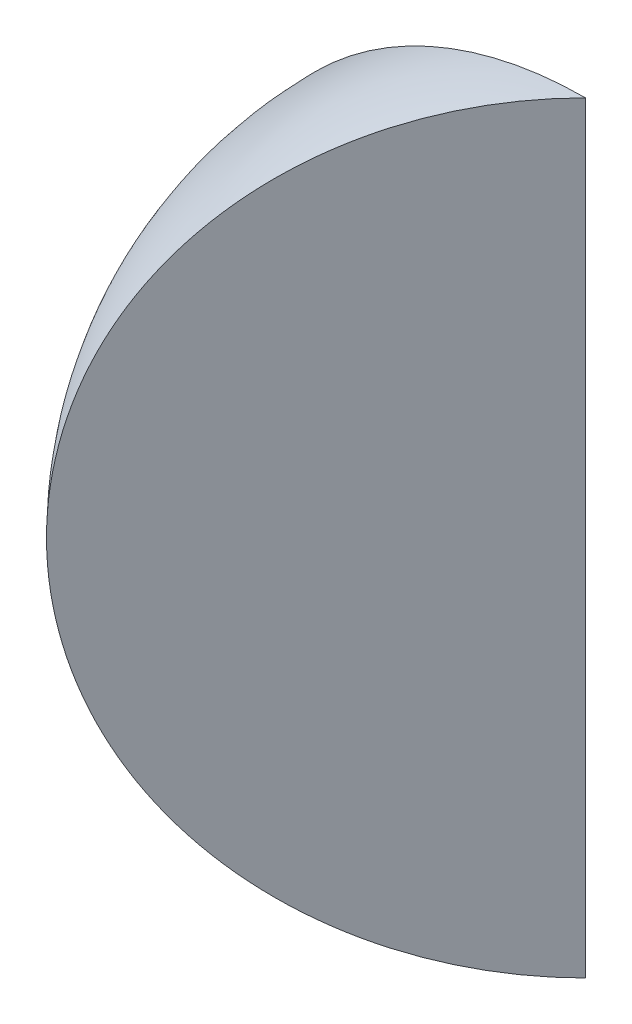
ISO-10303-21;
HEADER;
FILE_DESCRIPTION(('STEP AP214'),'2;1');
FILE_NAME('part.step','',(''),(''),'','','');
FILE_SCHEMA(('AUTOMOTIVE_DESIGN { 1 0 10303 214 1 1 1 1 }'));
ENDSEC;
DATA;
#1=APPLICATION_CONTEXT('core data for automotive mechanical design processes');
#2=APPLICATION_PROTOCOL_DEFINITION('international standard','automotive_design',2000,#1);
#3=PRODUCT_CONTEXT('',#1,'mechanical');
#4=PRODUCT('Part','Part','',(#3));
#5=PRODUCT_RELATED_PRODUCT_CATEGORY('part','',(#4));
#6=PRODUCT_DEFINITION_FORMATION('','',#4);
#7=PRODUCT_DEFINITION_CONTEXT('part definition',#1,'design');
#8=PRODUCT_DEFINITION('design','',#6,#7);
#9=PRODUCT_DEFINITION_SHAPE('','',#8);
#10=(LENGTH_UNIT() NAMED_UNIT(*) SI_UNIT(.MILLI.,.METRE.));
#11=(NAMED_UNIT(*) PLANE_ANGLE_UNIT() SI_UNIT($,.RADIAN.));
#12=(NAMED_UNIT(*) SI_UNIT($,.STERADIAN.) SOLID_ANGLE_UNIT());
#13=UNCERTAINTY_MEASURE_WITH_UNIT(LENGTH_MEASURE(1.E-05),#10,'distance_accuracy_value','');
#14=(GEOMETRIC_REPRESENTATION_CONTEXT(3) GLOBAL_UNCERTAINTY_ASSIGNED_CONTEXT((#13)) GLOBAL_UNIT_ASSIGNED_CONTEXT((#10,
#11,#12)) REPRESENTATION_CONTEXT('',''));
#15=CARTESIAN_POINT('',(0.,0.,0.));
#16=DIRECTION('',(0.,0.,1.));
#17=DIRECTION('',(1.,0.,0.));
#18=AXIS2_PLACEMENT_3D('',#15,#16,#17);
#19=CARTESIAN_POINT('',(0.,0.,0.));
#20=DIRECTION('',(-1.,0.,0.));
#21=DIRECTION('',(0.,0.,1.));
#22=AXIS2_PLACEMENT_3D('',#19,#20,#21);
#23=SPHERICAL_SURFACE('',#22,29.);
#24=CARTESIAN_POINT('',(0.,0.,0.));
#25=DIRECTION('',(0.707106781186549,0.,0.707106781186546));
#26=DIRECTION('',(0.707106781186546,0.,-0.707106781186549));
#27=AXIS2_PLACEMENT_3D('',#24,#25,#26);
#28=CIRCLE('',#27,29.);
#29=CARTESIAN_POINT('',(0.,29.,0.));
#30=VERTEX_POINT('',#29);
#31=CARTESIAN_POINT('',(0.,-29.,0.));
#32=VERTEX_POINT('',#31);
#33=EDGE_CURVE('E11',#30,#32,#28,.T.);
#34=ORIENTED_EDGE('',*,*,#33,.F.);
#35=CARTESIAN_POINT('',(0.,0.,0.));
#36=DIRECTION('',(0.,0.,-1.));
#37=DIRECTION('',(-1.,0.,0.));
#38=AXIS2_PLACEMENT_3D('',#35,#36,#37);
#39=CIRCLE('',#38,29.);
#40=EDGE_CURVE('E42',#32,#30,#39,.T.);
#41=ORIENTED_EDGE('',*,*,#40,.F.);
#42=EDGE_LOOP('',(#34,#41));
#43=FACE_BOUND('',#42,.T.);
#44=ADVANCED_FACE('F35',(#43),#23,.T.);
#45=CARTESIAN_POINT('',(0.,29.,0.));
#46=DIRECTION('',(0.707106781186549,0.,0.707106781186546));
#47=DIRECTION('',(0.707106781186546,0.,-0.707106781186549));
#48=AXIS2_PLACEMENT_3D('',#45,#46,#47);
#49=PLANE('',#48);
#50=ORIENTED_EDGE('',*,*,#33,.T.);
#51=DIRECTION('',(0.,-1.,0.));
#52=VECTOR('',#51,1.);
#53=CARTESIAN_POINT('',(0.,29.,0.));
#54=LINE('',#53,#52);
#55=EDGE_CURVE('E48',#30,#32,#54,.T.);
#56=ORIENTED_EDGE('',*,*,#55,.F.);
#57=EDGE_LOOP('',(#50,#56));
#58=FACE_BOUND('',#57,.T.);
#59=ADVANCED_FACE('F54',(#58),#49,.T.);
#60=CARTESIAN_POINT('',(0.,29.,0.));
#61=DIRECTION('',(0.,0.,-1.));
#62=DIRECTION('',(-1.,0.,0.));
#63=AXIS2_PLACEMENT_3D('',#60,#61,#62);
#64=PLANE('',#63);
#65=ORIENTED_EDGE('',*,*,#40,.T.);
#66=ORIENTED_EDGE('',*,*,#55,.T.);
#67=EDGE_LOOP('',(#65,#66));
#68=FACE_BOUND('',#67,.T.);
#69=ADVANCED_FACE('F50',(#68),#64,.T.);
#70=CLOSED_SHELL('',(#44,#59,#69));
#71=MANIFOLD_SOLID_BREP('B2',#70);
#72=ADVANCED_BREP_SHAPE_REPRESENTATION('',(#18,#71),#14);
#73=SHAPE_DEFINITION_REPRESENTATION(#9,#72);
ENDSEC;
END-ISO-10303-21;
